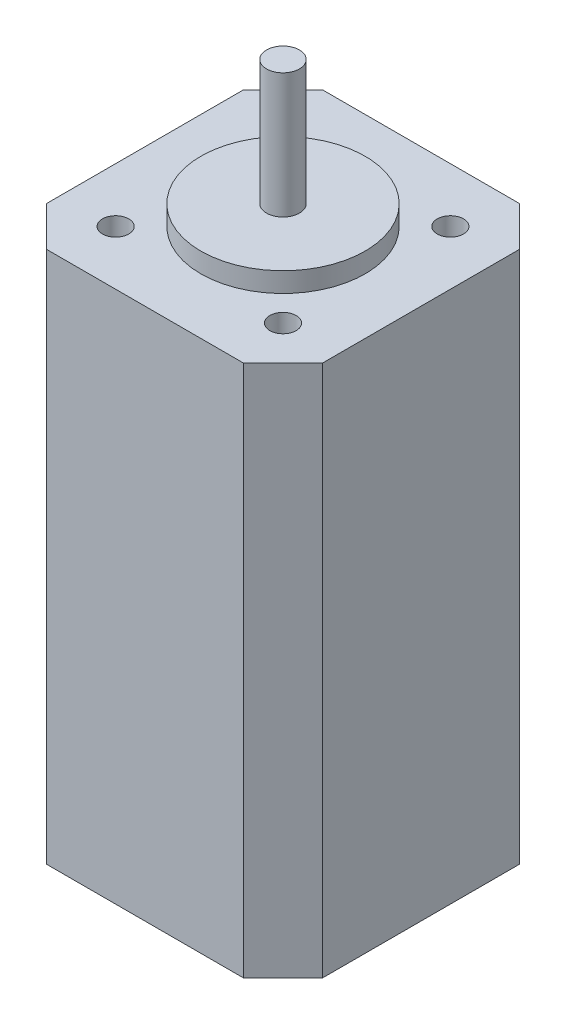
ISO-10303-21;
HEADER;
FILE_DESCRIPTION(('STEP AP214'),'2;1');
FILE_NAME('part.step','',(''),(''),'','','');
FILE_SCHEMA(('AUTOMOTIVE_DESIGN { 1 0 10303 214 1 1 1 1 }'));
ENDSEC;
DATA;
#1=APPLICATION_CONTEXT('core data for automotive mechanical design processes');
#2=APPLICATION_PROTOCOL_DEFINITION('international standard','automotive_design',2000,#1);
#3=PRODUCT_CONTEXT('',#1,'mechanical');
#4=PRODUCT('Part','Part','',(#3));
#5=PRODUCT_RELATED_PRODUCT_CATEGORY('part','',(#4));
#6=PRODUCT_DEFINITION_FORMATION('','',#4);
#7=PRODUCT_DEFINITION_CONTEXT('part definition',#1,'design');
#8=PRODUCT_DEFINITION('design','',#6,#7);
#9=PRODUCT_DEFINITION_SHAPE('','',#8);
#10=(LENGTH_UNIT() NAMED_UNIT(*) SI_UNIT(.MILLI.,.METRE.));
#11=(NAMED_UNIT(*) PLANE_ANGLE_UNIT() SI_UNIT($,.RADIAN.));
#12=(NAMED_UNIT(*) SI_UNIT($,.STERADIAN.) SOLID_ANGLE_UNIT());
#13=UNCERTAINTY_MEASURE_WITH_UNIT(LENGTH_MEASURE(1.E-05),#10,'distance_accuracy_value','');
#14=(GEOMETRIC_REPRESENTATION_CONTEXT(3) GLOBAL_UNCERTAINTY_ASSIGNED_CONTEXT((#13)) GLOBAL_UNIT_ASSIGNED_CONTEXT((#10,
#11,#12)) REPRESENTATION_CONTEXT('',''));
#15=CARTESIAN_POINT('',(0.,0.,0.));
#16=DIRECTION('',(0.,0.,1.));
#17=DIRECTION('',(1.,0.,0.));
#18=AXIS2_PLACEMENT_3D('',#15,#16,#17);
#19=CARTESIAN_POINT('',(0.,81.,0.));
#20=DIRECTION('',(-1.,0.,0.));
#21=DIRECTION('',(0.,0.,1.));
#22=AXIS2_PLACEMENT_3D('',#19,#20,#21);
#23=PLANE('',#22);
#24=DIRECTION('',(0.,0.,-1.));
#25=VECTOR('',#24,1.);
#26=CARTESIAN_POINT('',(0.,0.,0.));
#27=LINE('',#26,#25);
#28=CARTESIAN_POINT('',(0.,0.,-6.));
#29=VERTEX_POINT('',#28);
#30=CARTESIAN_POINT('',(0.,0.,-36.));
#31=VERTEX_POINT('',#30);
#32=EDGE_CURVE('E161',#29,#31,#27,.T.);
#33=ORIENTED_EDGE('',*,*,#32,.F.);
#34=DIRECTION('',(0.,-1.,0.));
#35=VECTOR('',#34,1.);
#36=CARTESIAN_POINT('',(0.,81.,-6.));
#37=LINE('',#36,#35);
#38=CARTESIAN_POINT('',(0.,81.,-6.));
#39=VERTEX_POINT('',#38);
#40=EDGE_CURVE('E47',#39,#29,#37,.T.);
#41=ORIENTED_EDGE('',*,*,#40,.F.);
#42=DIRECTION('',(0.,0.,-1.));
#43=VECTOR('',#42,1.);
#44=CARTESIAN_POINT('',(0.,81.,0.));
#45=LINE('',#44,#43);
#46=CARTESIAN_POINT('',(0.,81.,-36.));
#47=VERTEX_POINT('',#46);
#48=EDGE_CURVE('E292',#39,#47,#45,.T.);
#49=ORIENTED_EDGE('',*,*,#48,.T.);
#50=DIRECTION('',(0.,-1.,0.));
#51=VECTOR('',#50,1.);
#52=CARTESIAN_POINT('',(0.,81.,-36.));
#53=LINE('',#52,#51);
#54=EDGE_CURVE('E62',#47,#31,#53,.T.);
#55=ORIENTED_EDGE('',*,*,#54,.T.);
#56=EDGE_LOOP('',(#33,#41,#49,#55));
#57=FACE_BOUND('',#56,.T.);
#58=ADVANCED_FACE('F43',(#57),#23,.T.);
#59=CARTESIAN_POINT('',(3.,81.,-3.));
#60=DIRECTION('',(0.707106781186548,0.,-0.707106781186548));
#61=DIRECTION('',(-0.707106781186548,0.,-0.707106781186548));
#62=AXIS2_PLACEMENT_3D('',#59,#60,#61);
#63=PLANE('',#62);
#64=DIRECTION('',(0.707106781186548,0.,0.707106781186548));
#65=VECTOR('',#64,1.);
#66=CARTESIAN_POINT('',(3.,0.,-3.));
#67=LINE('',#66,#65);
#68=CARTESIAN_POINT('',(6.,0.,0.));
#69=VERTEX_POINT('',#68);
#70=EDGE_CURVE('E164',#29,#69,#67,.T.);
#71=ORIENTED_EDGE('',*,*,#70,.T.);
#72=DIRECTION('',(0.,-1.,0.));
#73=VECTOR('',#72,1.);
#74=CARTESIAN_POINT('',(6.,81.,0.));
#75=LINE('',#74,#73);
#76=CARTESIAN_POINT('',(6.,81.,0.));
#77=VERTEX_POINT('',#76);
#78=EDGE_CURVE('E203',#77,#69,#75,.T.);
#79=ORIENTED_EDGE('',*,*,#78,.F.);
#80=DIRECTION('',(0.707106781186548,0.,0.707106781186548));
#81=VECTOR('',#80,1.);
#82=CARTESIAN_POINT('',(3.,81.,-3.));
#83=LINE('',#82,#81);
#84=EDGE_CURVE('E213',#39,#77,#83,.T.);
#85=ORIENTED_EDGE('',*,*,#84,.F.);
#86=ORIENTED_EDGE('',*,*,#40,.T.);
#87=EDGE_LOOP('',(#71,#79,#85,#86));
#88=FACE_BOUND('',#87,.T.);
#89=ADVANCED_FACE('F211',(#88),#63,.F.);
#90=CARTESIAN_POINT('',(0.,81.,0.));
#91=DIRECTION('',(0.,0.,-1.));
#92=DIRECTION('',(-1.,0.,0.));
#93=AXIS2_PLACEMENT_3D('',#90,#91,#92);
#94=PLANE('',#93);
#95=DIRECTION('',(1.,0.,0.));
#96=VECTOR('',#95,1.);
#97=CARTESIAN_POINT('',(0.,0.,0.));
#98=LINE('',#97,#96);
#99=CARTESIAN_POINT('',(36.,0.,0.));
#100=VERTEX_POINT('',#99);
#101=EDGE_CURVE('E168',#69,#100,#98,.T.);
#102=ORIENTED_EDGE('',*,*,#101,.T.);
#103=DIRECTION('',(0.,-1.,0.));
#104=VECTOR('',#103,1.);
#105=CARTESIAN_POINT('',(36.,81.,0.));
#106=LINE('',#105,#104);
#107=CARTESIAN_POINT('',(36.,81.,0.));
#108=VERTEX_POINT('',#107);
#109=EDGE_CURVE('E200',#108,#100,#106,.T.);
#110=ORIENTED_EDGE('',*,*,#109,.F.);
#111=DIRECTION('',(1.,0.,0.));
#112=VECTOR('',#111,1.);
#113=CARTESIAN_POINT('',(0.,81.,0.));
#114=LINE('',#113,#112);
#115=EDGE_CURVE('E284',#77,#108,#114,.T.);
#116=ORIENTED_EDGE('',*,*,#115,.F.);
#117=ORIENTED_EDGE('',*,*,#78,.T.);
#118=EDGE_LOOP('',(#102,#110,#116,#117));
#119=FACE_BOUND('',#118,.T.);
#120=ADVANCED_FACE('F221',(#119),#94,.F.);
#121=CARTESIAN_POINT('',(18.,81.,18.));
#122=DIRECTION('',(-0.707106781186548,0.,-0.707106781186547));
#123=DIRECTION('',(-0.707106781186547,0.,0.707106781186548));
#124=AXIS2_PLACEMENT_3D('',#121,#122,#123);
#125=PLANE('',#124);
#126=DIRECTION('',(0.707106781186547,0.,-0.707106781186548));
#127=VECTOR('',#126,1.);
#128=CARTESIAN_POINT('',(18.,0.,18.));
#129=LINE('',#128,#127);
#130=CARTESIAN_POINT('',(42.,0.,-6.));
#131=VERTEX_POINT('',#130);
#132=EDGE_CURVE('E172',#100,#131,#129,.T.);
#133=ORIENTED_EDGE('',*,*,#132,.T.);
#134=DIRECTION('',(0.,-1.,0.));
#135=VECTOR('',#134,1.);
#136=CARTESIAN_POINT('',(42.,81.,-6.));
#137=LINE('',#136,#135);
#138=CARTESIAN_POINT('',(42.,81.,-6.));
#139=VERTEX_POINT('',#138);
#140=EDGE_CURVE('E196',#139,#131,#137,.T.);
#141=ORIENTED_EDGE('',*,*,#140,.F.);
#142=DIRECTION('',(0.707106781186547,0.,-0.707106781186548));
#143=VECTOR('',#142,1.);
#144=CARTESIAN_POINT('',(18.,81.,18.));
#145=LINE('',#144,#143);
#146=EDGE_CURVE('E286',#108,#139,#145,.T.);
#147=ORIENTED_EDGE('',*,*,#146,.F.);
#148=ORIENTED_EDGE('',*,*,#109,.T.);
#149=EDGE_LOOP('',(#133,#141,#147,#148));
#150=FACE_BOUND('',#149,.T.);
#151=ADVANCED_FACE('F275',(#150),#125,.F.);
#152=CARTESIAN_POINT('',(42.,81.,0.));
#153=DIRECTION('',(-1.,0.,0.));
#154=DIRECTION('',(0.,0.,1.));
#155=AXIS2_PLACEMENT_3D('',#152,#153,#154);
#156=PLANE('',#155);
#157=DIRECTION('',(0.,0.,-1.));
#158=VECTOR('',#157,1.);
#159=CARTESIAN_POINT('',(42.,0.,0.));
#160=LINE('',#159,#158);
#161=CARTESIAN_POINT('',(42.,0.,-36.));
#162=VERTEX_POINT('',#161);
#163=EDGE_CURVE('E176',#131,#162,#160,.T.);
#164=ORIENTED_EDGE('',*,*,#163,.T.);
#165=DIRECTION('',(0.,-1.,0.));
#166=VECTOR('',#165,1.);
#167=CARTESIAN_POINT('',(42.,81.,-36.));
#168=LINE('',#167,#166);
#169=CARTESIAN_POINT('',(42.,81.,-36.));
#170=VERTEX_POINT('',#169);
#171=EDGE_CURVE('E123',#170,#162,#168,.T.);
#172=ORIENTED_EDGE('',*,*,#171,.F.);
#173=DIRECTION('',(0.,0.,-1.));
#174=VECTOR('',#173,1.);
#175=CARTESIAN_POINT('',(42.,81.,0.));
#176=LINE('',#175,#174);
#177=EDGE_CURVE('E132',#139,#170,#176,.T.);
#178=ORIENTED_EDGE('',*,*,#177,.F.);
#179=ORIENTED_EDGE('',*,*,#140,.T.);
#180=EDGE_LOOP('',(#164,#172,#178,#179));
#181=FACE_BOUND('',#180,.T.);
#182=ADVANCED_FACE('F272',(#181),#156,.F.);
#183=CARTESIAN_POINT('',(39.,81.,-39.));
#184=DIRECTION('',(0.707106781186548,0.,-0.707106781186548));
#185=DIRECTION('',(-0.707106781186548,0.,-0.707106781186548));
#186=AXIS2_PLACEMENT_3D('',#183,#184,#185);
#187=PLANE('',#186);
#188=DIRECTION('',(0.707106781186548,0.,0.707106781186548));
#189=VECTOR('',#188,1.);
#190=CARTESIAN_POINT('',(39.,0.,-39.));
#191=LINE('',#190,#189);
#192=CARTESIAN_POINT('',(36.,0.,-42.));
#193=VERTEX_POINT('',#192);
#194=EDGE_CURVE('E118',#193,#162,#191,.T.);
#195=ORIENTED_EDGE('',*,*,#194,.F.);
#196=DIRECTION('',(0.,-1.,0.));
#197=VECTOR('',#196,1.);
#198=CARTESIAN_POINT('',(36.,81.,-42.));
#199=LINE('',#198,#197);
#200=CARTESIAN_POINT('',(36.,81.,-42.));
#201=VERTEX_POINT('',#200);
#202=EDGE_CURVE('E113',#201,#193,#199,.T.);
#203=ORIENTED_EDGE('',*,*,#202,.F.);
#204=DIRECTION('',(0.707106781186548,0.,0.707106781186548));
#205=VECTOR('',#204,1.);
#206=CARTESIAN_POINT('',(39.,81.,-39.));
#207=LINE('',#206,#205);
#208=EDGE_CURVE('E116',#201,#170,#207,.T.);
#209=ORIENTED_EDGE('',*,*,#208,.T.);
#210=ORIENTED_EDGE('',*,*,#171,.T.);
#211=EDGE_LOOP('',(#195,#203,#209,#210));
#212=FACE_BOUND('',#211,.T.);
#213=ADVANCED_FACE('F115',(#212),#187,.T.);
#214=CARTESIAN_POINT('',(0.,81.,-42.));
#215=DIRECTION('',(0.,0.,-1.));
#216=DIRECTION('',(-1.,0.,0.));
#217=AXIS2_PLACEMENT_3D('',#214,#215,#216);
#218=PLANE('',#217);
#219=DIRECTION('',(1.,0.,0.));
#220=VECTOR('',#219,1.);
#221=CARTESIAN_POINT('',(0.,0.,-42.));
#222=LINE('',#221,#220);
#223=CARTESIAN_POINT('',(6.,0.,-42.));
#224=VERTEX_POINT('',#223);
#225=EDGE_CURVE('E182',#224,#193,#222,.T.);
#226=ORIENTED_EDGE('',*,*,#225,.F.);
#227=DIRECTION('',(0.,-1.,0.));
#228=VECTOR('',#227,1.);
#229=CARTESIAN_POINT('',(6.,81.,-42.));
#230=LINE('',#229,#228);
#231=CARTESIAN_POINT('',(6.,81.,-42.));
#232=VERTEX_POINT('',#231);
#233=EDGE_CURVE('E88',#232,#224,#230,.T.);
#234=ORIENTED_EDGE('',*,*,#233,.F.);
#235=DIRECTION('',(1.,0.,0.));
#236=VECTOR('',#235,1.);
#237=CARTESIAN_POINT('',(0.,81.,-42.));
#238=LINE('',#237,#236);
#239=EDGE_CURVE('E130',#232,#201,#238,.T.);
#240=ORIENTED_EDGE('',*,*,#239,.T.);
#241=ORIENTED_EDGE('',*,*,#202,.T.);
#242=EDGE_LOOP('',(#226,#234,#240,#241));
#243=FACE_BOUND('',#242,.T.);
#244=ADVANCED_FACE('F136',(#243),#218,.T.);
#245=CARTESIAN_POINT('',(8.2720779386424,81.,-8.27207793864186));
#246=DIRECTION('',(0.,-1.,0.));
#247=DIRECTION('',(0.,0.,-1.));
#248=AXIS2_PLACEMENT_3D('',#245,#246,#247);
#249=CYLINDRICAL_SURFACE('',#248,2.00000000000001);
#250=CARTESIAN_POINT('',(8.2720779386424,81.,-8.27207793864186));
#251=DIRECTION('',(0.,1.,0.));
#252=DIRECTION('',(0.,0.,1.));
#253=AXIS2_PLACEMENT_3D('',#250,#251,#252);
#254=CIRCLE('',#253,2.00000000000001);
#255=CARTESIAN_POINT('',(8.2720779386424,81.,-6.27207793864186));
#256=VERTEX_POINT('',#255);
#257=EDGE_CURVE('E298',#256,#256,#254,.T.);
#258=ORIENTED_EDGE('',*,*,#257,.T.);
#259=EDGE_LOOP('',(#258));
#260=FACE_BOUND('',#259,.T.);
#261=CARTESIAN_POINT('',(8.2720779386424,0.,-8.27207793864186));
#262=DIRECTION('',(0.,1.,0.));
#263=DIRECTION('',(0.,0.,1.));
#264=AXIS2_PLACEMENT_3D('',#261,#262,#263);
#265=CIRCLE('',#264,2.00000000000001);
#266=CARTESIAN_POINT('',(8.2720779386424,0.,-6.27207793864186));
#267=VERTEX_POINT('',#266);
#268=EDGE_CURVE('E157',#267,#267,#265,.T.);
#269=ORIENTED_EDGE('',*,*,#268,.F.);
#270=EDGE_LOOP('',(#269));
#271=FACE_BOUND('',#270,.T.);
#272=ADVANCED_FACE('F225',(#260,#271),#249,.F.);
#273=CARTESIAN_POINT('',(33.7279220613582,81.,-8.27207793864211));
#274=DIRECTION('',(0.,-1.,0.));
#275=DIRECTION('',(0.,0.,-1.));
#276=AXIS2_PLACEMENT_3D('',#273,#274,#275);
#277=CYLINDRICAL_SURFACE('',#276,2.);
#278=CARTESIAN_POINT('',(33.7279220613582,81.,-8.27207793864211));
#279=DIRECTION('',(0.,1.,0.));
#280=DIRECTION('',(0.,0.,1.));
#281=AXIS2_PLACEMENT_3D('',#278,#279,#280);
#282=CIRCLE('',#281,2.);
#283=CARTESIAN_POINT('',(33.7279220613582,81.,-6.27207793864211));
#284=VERTEX_POINT('',#283);
#285=EDGE_CURVE('E302',#284,#284,#282,.T.);
#286=ORIENTED_EDGE('',*,*,#285,.T.);
#287=EDGE_LOOP('',(#286));
#288=FACE_BOUND('',#287,.T.);
#289=CARTESIAN_POINT('',(33.7279220613582,0.,-8.27207793864211));
#290=DIRECTION('',(0.,1.,0.));
#291=DIRECTION('',(0.,0.,1.));
#292=AXIS2_PLACEMENT_3D('',#289,#290,#291);
#293=CIRCLE('',#292,2.);
#294=CARTESIAN_POINT('',(33.7279220613582,0.,-6.27207793864211));
#295=VERTEX_POINT('',#294);
#296=EDGE_CURVE('E153',#295,#295,#293,.T.);
#297=ORIENTED_EDGE('',*,*,#296,.F.);
#298=EDGE_LOOP('',(#297));
#299=FACE_BOUND('',#298,.T.);
#300=ADVANCED_FACE('F228',(#288,#299),#277,.F.);
#301=CARTESIAN_POINT('',(33.7279220613578,81.,-33.7279220613579));
#302=DIRECTION('',(0.,-1.,0.));
#303=DIRECTION('',(0.,0.,-1.));
#304=AXIS2_PLACEMENT_3D('',#301,#302,#303);
#305=CYLINDRICAL_SURFACE('',#304,2.);
#306=CARTESIAN_POINT('',(33.7279220613578,81.,-33.7279220613579));
#307=DIRECTION('',(0.,1.,0.));
#308=DIRECTION('',(0.,0.,1.));
#309=AXIS2_PLACEMENT_3D('',#306,#307,#308);
#310=CIRCLE('',#309,2.);
#311=CARTESIAN_POINT('',(33.7279220613578,81.,-31.7279220613579));
#312=VERTEX_POINT('',#311);
#313=EDGE_CURVE('E243',#312,#312,#310,.T.);
#314=ORIENTED_EDGE('',*,*,#313,.T.);
#315=EDGE_LOOP('',(#314));
#316=FACE_BOUND('',#315,.T.);
#317=CARTESIAN_POINT('',(33.7279220613578,0.,-33.7279220613579));
#318=DIRECTION('',(0.,1.,0.));
#319=DIRECTION('',(0.,0.,1.));
#320=AXIS2_PLACEMENT_3D('',#317,#318,#319);
#321=CIRCLE('',#320,2.);
#322=CARTESIAN_POINT('',(33.7279220613578,0.,-31.7279220613579));
#323=VERTEX_POINT('',#322);
#324=EDGE_CURVE('E148',#323,#323,#321,.T.);
#325=ORIENTED_EDGE('',*,*,#324,.F.);
#326=EDGE_LOOP('',(#325));
#327=FACE_BOUND('',#326,.T.);
#328=ADVANCED_FACE('F231',(#316,#327),#305,.F.);
#329=CARTESIAN_POINT('',(8.27207793864226,81.,-33.7279220613576));
#330=DIRECTION('',(0.,-1.,0.));
#331=DIRECTION('',(0.,0.,-1.));
#332=AXIS2_PLACEMENT_3D('',#329,#330,#331);
#333=CYLINDRICAL_SURFACE('',#332,2.);
#334=CARTESIAN_POINT('',(8.27207793864226,81.,-33.7279220613576));
#335=DIRECTION('',(0.,1.,0.));
#336=DIRECTION('',(0.,0.,1.));
#337=AXIS2_PLACEMENT_3D('',#334,#335,#336);
#338=CIRCLE('',#337,2.);
#339=CARTESIAN_POINT('',(8.27207793864226,81.,-31.7279220613576));
#340=VERTEX_POINT('',#339);
#341=EDGE_CURVE('E189',#340,#340,#338,.T.);
#342=ORIENTED_EDGE('',*,*,#341,.T.);
#343=EDGE_LOOP('',(#342));
#344=FACE_BOUND('',#343,.T.);
#345=CARTESIAN_POINT('',(8.27207793864226,0.,-33.7279220613576));
#346=DIRECTION('',(0.,1.,0.));
#347=DIRECTION('',(0.,0.,1.));
#348=AXIS2_PLACEMENT_3D('',#345,#346,#347);
#349=CIRCLE('',#348,2.);
#350=CARTESIAN_POINT('',(8.27207793864226,0.,-31.7279220613576));
#351=VERTEX_POINT('',#350);
#352=EDGE_CURVE('E144',#351,#351,#349,.T.);
#353=ORIENTED_EDGE('',*,*,#352,.F.);
#354=EDGE_LOOP('',(#353));
#355=FACE_BOUND('',#354,.T.);
#356=ADVANCED_FACE('F45',(#344,#355),#333,.F.);
#357=CARTESIAN_POINT('',(-18.,81.,-18.));
#358=DIRECTION('',(-0.707106781186547,0.,-0.707106781186548));
#359=DIRECTION('',(-0.707106781186548,0.,0.707106781186547));
#360=AXIS2_PLACEMENT_3D('',#357,#358,#359);
#361=PLANE('',#360);
#362=DIRECTION('',(0.707106781186548,0.,-0.707106781186547));
#363=VECTOR('',#362,1.);
#364=CARTESIAN_POINT('',(-18.,0.,-18.));
#365=LINE('',#364,#363);
#366=EDGE_CURVE('E185',#31,#224,#365,.T.);
#367=ORIENTED_EDGE('',*,*,#366,.F.);
#368=ORIENTED_EDGE('',*,*,#54,.F.);
#369=DIRECTION('',(0.707106781186548,0.,-0.707106781186547));
#370=VECTOR('',#369,1.);
#371=CARTESIAN_POINT('',(-18.,81.,-18.));
#372=LINE('',#371,#370);
#373=EDGE_CURVE('E138',#47,#232,#372,.T.);
#374=ORIENTED_EDGE('',*,*,#373,.T.);
#375=ORIENTED_EDGE('',*,*,#233,.T.);
#376=EDGE_LOOP('',(#367,#368,#374,#375));
#377=FACE_BOUND('',#376,.T.);
#378=ADVANCED_FACE('F238',(#377),#361,.T.);
#379=CARTESIAN_POINT('',(0.,81.,0.));
#380=DIRECTION('',(0.,1.,0.));
#381=DIRECTION('',(0.,0.,1.));
#382=AXIS2_PLACEMENT_3D('',#379,#380,#381);
#383=PLANE('',#382);
#384=CARTESIAN_POINT('',(21.0000000000001,81.,-21.0000000000001));
#385=DIRECTION('',(0.,1.,0.));
#386=DIRECTION('',(0.,0.,1.));
#387=AXIS2_PLACEMENT_3D('',#384,#385,#386);
#388=CIRCLE('',#387,12.5);
#389=CARTESIAN_POINT('',(21.0000000000001,81.,-8.50000000000015));
#390=VERTEX_POINT('',#389);
#391=EDGE_CURVE('E311',#390,#390,#388,.T.);
#392=ORIENTED_EDGE('',*,*,#391,.F.);
#393=EDGE_LOOP('',(#392));
#394=FACE_BOUND('',#393,.T.);
#395=ORIENTED_EDGE('',*,*,#341,.F.);
#396=EDGE_LOOP('',(#395));
#397=FACE_BOUND('',#396,.T.);
#398=ORIENTED_EDGE('',*,*,#313,.F.);
#399=EDGE_LOOP('',(#398));
#400=FACE_BOUND('',#399,.T.);
#401=ORIENTED_EDGE('',*,*,#285,.F.);
#402=EDGE_LOOP('',(#401));
#403=FACE_BOUND('',#402,.T.);
#404=ORIENTED_EDGE('',*,*,#257,.F.);
#405=EDGE_LOOP('',(#404));
#406=FACE_BOUND('',#405,.T.);
#407=ORIENTED_EDGE('',*,*,#48,.F.);
#408=ORIENTED_EDGE('',*,*,#84,.T.);
#409=ORIENTED_EDGE('',*,*,#115,.T.);
#410=ORIENTED_EDGE('',*,*,#146,.T.);
#411=ORIENTED_EDGE('',*,*,#177,.T.);
#412=ORIENTED_EDGE('',*,*,#208,.F.);
#413=ORIENTED_EDGE('',*,*,#239,.F.);
#414=ORIENTED_EDGE('',*,*,#373,.F.);
#415=EDGE_LOOP('',(#407,#408,#409,#410,#411,#412,#413,#414));
#416=FACE_BOUND('',#415,.T.);
#417=ADVANCED_FACE('F128',(#394,#397,#400,#403,#406,#416),#383,.T.);
#418=CARTESIAN_POINT('',(0.,0.,0.));
#419=DIRECTION('',(0.,1.,0.));
#420=DIRECTION('',(0.,0.,1.));
#421=AXIS2_PLACEMENT_3D('',#418,#419,#420);
#422=PLANE('',#421);
#423=ORIENTED_EDGE('',*,*,#352,.T.);
#424=EDGE_LOOP('',(#423));
#425=FACE_BOUND('',#424,.T.);
#426=ORIENTED_EDGE('',*,*,#324,.T.);
#427=EDGE_LOOP('',(#426));
#428=FACE_BOUND('',#427,.T.);
#429=ORIENTED_EDGE('',*,*,#296,.T.);
#430=EDGE_LOOP('',(#429));
#431=FACE_BOUND('',#430,.T.);
#432=ORIENTED_EDGE('',*,*,#268,.T.);
#433=EDGE_LOOP('',(#432));
#434=FACE_BOUND('',#433,.T.);
#435=ORIENTED_EDGE('',*,*,#32,.T.);
#436=ORIENTED_EDGE('',*,*,#366,.T.);
#437=ORIENTED_EDGE('',*,*,#225,.T.);
#438=ORIENTED_EDGE('',*,*,#194,.T.);
#439=ORIENTED_EDGE('',*,*,#163,.F.);
#440=ORIENTED_EDGE('',*,*,#132,.F.);
#441=ORIENTED_EDGE('',*,*,#101,.F.);
#442=ORIENTED_EDGE('',*,*,#70,.F.);
#443=EDGE_LOOP('',(#435,#436,#437,#438,#439,#440,#441,#442));
#444=FACE_BOUND('',#443,.T.);
#445=ADVANCED_FACE('F215',(#425,#428,#431,#434,#444),#422,.F.);
#446=CARTESIAN_POINT('',(21.0000000000001,84.,-21.0000000000001));
#447=DIRECTION('',(0.,-1.,0.));
#448=DIRECTION('',(0.,0.,-1.));
#449=AXIS2_PLACEMENT_3D('',#446,#447,#448);
#450=CYLINDRICAL_SURFACE('',#449,12.5);
#451=CARTESIAN_POINT('',(21.0000000000001,84.,-21.0000000000001));
#452=DIRECTION('',(0.,1.,0.));
#453=DIRECTION('',(0.,0.,1.));
#454=AXIS2_PLACEMENT_3D('',#451,#452,#453);
#455=CIRCLE('',#454,12.5);
#456=CARTESIAN_POINT('',(21.0000000000001,84.,-8.50000000000015));
#457=VERTEX_POINT('',#456);
#458=EDGE_CURVE('E149',#457,#457,#455,.T.);
#459=ORIENTED_EDGE('',*,*,#458,.F.);
#460=EDGE_LOOP('',(#459));
#461=FACE_BOUND('',#460,.T.);
#462=ORIENTED_EDGE('',*,*,#391,.T.);
#463=EDGE_LOOP('',(#462));
#464=FACE_BOUND('',#463,.T.);
#465=ADVANCED_FACE('F248',(#461,#464),#450,.T.);
#466=CARTESIAN_POINT('',(0.,84.,0.));
#467=DIRECTION('',(0.,1.,0.));
#468=DIRECTION('',(0.,0.,1.));
#469=AXIS2_PLACEMENT_3D('',#466,#467,#468);
#470=PLANE('',#469);
#471=CARTESIAN_POINT('',(21.0000000000001,84.,-21.0000000000001));
#472=DIRECTION('',(0.,1.,0.));
#473=DIRECTION('',(0.,0.,1.));
#474=AXIS2_PLACEMENT_3D('',#471,#472,#473);
#475=CIRCLE('',#474,2.5);
#476=CARTESIAN_POINT('',(21.0000000000001,84.,-18.5000000000002));
#477=VERTEX_POINT('',#476);
#478=EDGE_CURVE('E11',#477,#477,#475,.T.);
#479=ORIENTED_EDGE('',*,*,#478,.F.);
#480=EDGE_LOOP('',(#479));
#481=FACE_BOUND('',#480,.T.);
#482=ORIENTED_EDGE('',*,*,#458,.T.);
#483=EDGE_LOOP('',(#482));
#484=FACE_BOUND('',#483,.T.);
#485=ADVANCED_FACE('F260',(#481,#484),#470,.T.);
#486=CARTESIAN_POINT('',(21.0000000000001,103.,-21.0000000000001));
#487=DIRECTION('',(0.,-1.,0.));
#488=DIRECTION('',(0.,0.,-1.));
#489=AXIS2_PLACEMENT_3D('',#486,#487,#488);
#490=CYLINDRICAL_SURFACE('',#489,2.5);
#491=CARTESIAN_POINT('',(21.0000000000001,103.,-21.0000000000001));
#492=DIRECTION('',(0.,1.,0.));
#493=DIRECTION('',(0.,0.,1.));
#494=AXIS2_PLACEMENT_3D('',#491,#492,#493);
#495=CIRCLE('',#494,2.5);
#496=CARTESIAN_POINT('',(21.0000000000001,103.,-18.5000000000002));
#497=VERTEX_POINT('',#496);
#498=EDGE_CURVE('E315',#497,#497,#495,.T.);
#499=ORIENTED_EDGE('',*,*,#498,.F.);
#500=EDGE_LOOP('',(#499));
#501=FACE_BOUND('',#500,.T.);
#502=ORIENTED_EDGE('',*,*,#478,.T.);
#503=EDGE_LOOP('',(#502));
#504=FACE_BOUND('',#503,.T.);
#505=ADVANCED_FACE('F325',(#501,#504),#490,.T.);
#506=CARTESIAN_POINT('',(21.0000000000001,103.,-21.0000000000001));
#507=DIRECTION('',(0.,1.,0.));
#508=DIRECTION('',(0.,0.,1.));
#509=AXIS2_PLACEMENT_3D('',#506,#507,#508);
#510=PLANE('',#509);
#511=ORIENTED_EDGE('',*,*,#498,.T.);
#512=EDGE_LOOP('',(#511));
#513=FACE_BOUND('',#512,.T.);
#514=ADVANCED_FACE('F323',(#513),#510,.T.);
#515=CLOSED_SHELL('',(#58,#89,#120,#151,#182,#213,#244,#272,#300,#328,#356,#378,#417,#445,#465,
#485,#505,#514));
#516=MANIFOLD_SOLID_BREP('B2',#515);
#517=ADVANCED_BREP_SHAPE_REPRESENTATION('',(#18,#516),#14);
#518=SHAPE_DEFINITION_REPRESENTATION(#9,#517);
ENDSEC;
END-ISO-10303-21;
